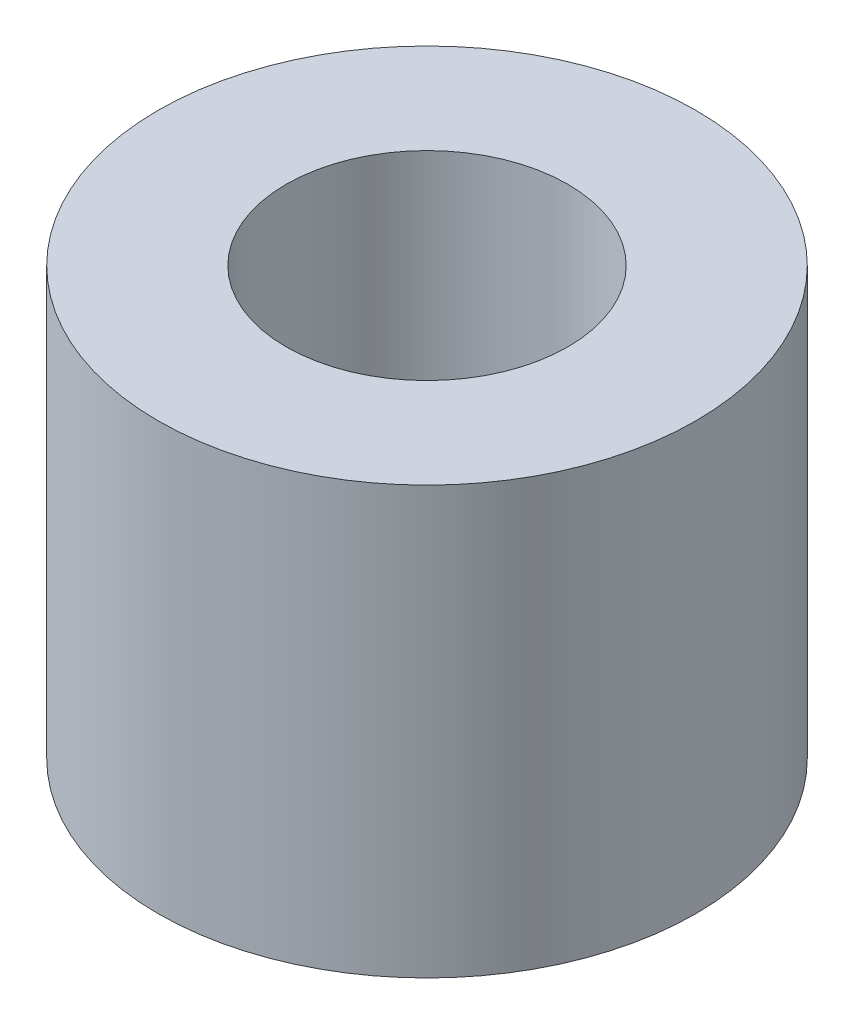
ISO-10303-21;
HEADER;
FILE_DESCRIPTION(('STEP AP214'),'2;1');
FILE_NAME('part.step','',(''),(''),'','','');
FILE_SCHEMA(('AUTOMOTIVE_DESIGN { 1 0 10303 214 1 1 1 1 }'));
ENDSEC;
DATA;
#1=APPLICATION_CONTEXT('core data for automotive mechanical design processes');
#2=APPLICATION_PROTOCOL_DEFINITION('international standard','automotive_design',2000,#1);
#3=PRODUCT_CONTEXT('',#1,'mechanical');
#4=PRODUCT('Part','Part','',(#3));
#5=PRODUCT_RELATED_PRODUCT_CATEGORY('part','',(#4));
#6=PRODUCT_DEFINITION_FORMATION('','',#4);
#7=PRODUCT_DEFINITION_CONTEXT('part definition',#1,'design');
#8=PRODUCT_DEFINITION('design','',#6,#7);
#9=PRODUCT_DEFINITION_SHAPE('','',#8);
#10=(LENGTH_UNIT() NAMED_UNIT(*) SI_UNIT(.MILLI.,.METRE.));
#11=(NAMED_UNIT(*) PLANE_ANGLE_UNIT() SI_UNIT($,.RADIAN.));
#12=(NAMED_UNIT(*) SI_UNIT($,.STERADIAN.) SOLID_ANGLE_UNIT());
#13=UNCERTAINTY_MEASURE_WITH_UNIT(LENGTH_MEASURE(1.E-05),#10,'distance_accuracy_value','');
#14=(GEOMETRIC_REPRESENTATION_CONTEXT(3) GLOBAL_UNCERTAINTY_ASSIGNED_CONTEXT((#13)) GLOBAL_UNIT_ASSIGNED_CONTEXT((#10,
#11,#12)) REPRESENTATION_CONTEXT('',''));
#15=CARTESIAN_POINT('',(0.,0.,0.));
#16=DIRECTION('',(0.,0.,1.));
#17=DIRECTION('',(1.,0.,0.));
#18=AXIS2_PLACEMENT_3D('',#15,#16,#17);
#19=CARTESIAN_POINT('',(0.,5.,0.));
#20=DIRECTION('',(0.,1.,0.));
#21=DIRECTION('',(0.,0.,1.));
#22=AXIS2_PLACEMENT_3D('',#19,#20,#21);
#23=PLANE('',#22);
#24=CARTESIAN_POINT('',(0.,5.,0.));
#25=DIRECTION('',(0.,1.,0.));
#26=DIRECTION('',(0.,0.,1.));
#27=AXIS2_PLACEMENT_3D('',#24,#25,#26);
#28=CIRCLE('',#27,6.3);
#29=CARTESIAN_POINT('',(0.,5.,6.3));
#30=VERTEX_POINT('',#29);
#31=EDGE_CURVE('E10',#30,#30,#28,.T.);
#32=ORIENTED_EDGE('',*,*,#31,.T.);
#33=EDGE_LOOP('',(#32));
#34=FACE_BOUND('',#33,.T.);
#35=CARTESIAN_POINT('',(0.,5.,0.));
#36=DIRECTION('',(0.,1.,0.));
#37=DIRECTION('',(0.,0.,1.));
#38=AXIS2_PLACEMENT_3D('',#35,#36,#37);
#39=CIRCLE('',#38,3.3);
#40=CARTESIAN_POINT('',(0.,5.,3.3));
#41=VERTEX_POINT('',#40);
#42=EDGE_CURVE('E42',#41,#41,#39,.T.);
#43=ORIENTED_EDGE('',*,*,#42,.F.);
#44=EDGE_LOOP('',(#43));
#45=FACE_BOUND('',#44,.T.);
#46=ADVANCED_FACE('F31',(#34,#45),#23,.T.);
#47=CARTESIAN_POINT('',(0.,-5.,0.));
#48=DIRECTION('',(0.,1.,0.));
#49=DIRECTION('',(0.,0.,1.));
#50=AXIS2_PLACEMENT_3D('',#47,#48,#49);
#51=PLANE('',#50);
#52=CARTESIAN_POINT('',(0.,-5.,0.));
#53=DIRECTION('',(0.,1.,0.));
#54=DIRECTION('',(0.,0.,1.));
#55=AXIS2_PLACEMENT_3D('',#52,#53,#54);
#56=CIRCLE('',#55,6.3);
#57=CARTESIAN_POINT('',(0.,-5.,6.3));
#58=VERTEX_POINT('',#57);
#59=EDGE_CURVE('E35',#58,#58,#56,.T.);
#60=ORIENTED_EDGE('',*,*,#59,.F.);
#61=EDGE_LOOP('',(#60));
#62=FACE_BOUND('',#61,.T.);
#63=CARTESIAN_POINT('',(0.,-5.,0.));
#64=DIRECTION('',(0.,1.,0.));
#65=DIRECTION('',(0.,0.,1.));
#66=AXIS2_PLACEMENT_3D('',#63,#64,#65);
#67=CIRCLE('',#66,3.3);
#68=CARTESIAN_POINT('',(0.,-5.,3.3));
#69=VERTEX_POINT('',#68);
#70=EDGE_CURVE('E44',#69,#69,#67,.T.);
#71=ORIENTED_EDGE('',*,*,#70,.T.);
#72=EDGE_LOOP('',(#71));
#73=FACE_BOUND('',#72,.T.);
#74=ADVANCED_FACE('F54',(#62,#73),#51,.F.);
#75=CARTESIAN_POINT('',(0.,5.,0.));
#76=DIRECTION('',(0.,-1.,0.));
#77=DIRECTION('',(0.,0.,-1.));
#78=AXIS2_PLACEMENT_3D('',#75,#76,#77);
#79=CYLINDRICAL_SURFACE('',#78,6.3);
#80=ORIENTED_EDGE('',*,*,#31,.F.);
#81=EDGE_LOOP('',(#80));
#82=FACE_BOUND('',#81,.T.);
#83=ORIENTED_EDGE('',*,*,#59,.T.);
#84=EDGE_LOOP('',(#83));
#85=FACE_BOUND('',#84,.T.);
#86=ADVANCED_FACE('F33',(#82,#85),#79,.T.);
#87=CARTESIAN_POINT('',(0.,5.,0.));
#88=DIRECTION('',(0.,-1.,0.));
#89=DIRECTION('',(0.,0.,-1.));
#90=AXIS2_PLACEMENT_3D('',#87,#88,#89);
#91=CYLINDRICAL_SURFACE('',#90,3.3);
#92=ORIENTED_EDGE('',*,*,#42,.T.);
#93=EDGE_LOOP('',(#92));
#94=FACE_BOUND('',#93,.T.);
#95=ORIENTED_EDGE('',*,*,#70,.F.);
#96=EDGE_LOOP('',(#95));
#97=FACE_BOUND('',#96,.T.);
#98=ADVANCED_FACE('F50',(#94,#97),#91,.F.);
#99=CLOSED_SHELL('',(#46,#74,#86,#98));
#100=MANIFOLD_SOLID_BREP('B2',#99);
#101=ADVANCED_BREP_SHAPE_REPRESENTATION('',(#18,#100),#14);
#102=SHAPE_DEFINITION_REPRESENTATION(#9,#101);
ENDSEC;
END-ISO-10303-21;
